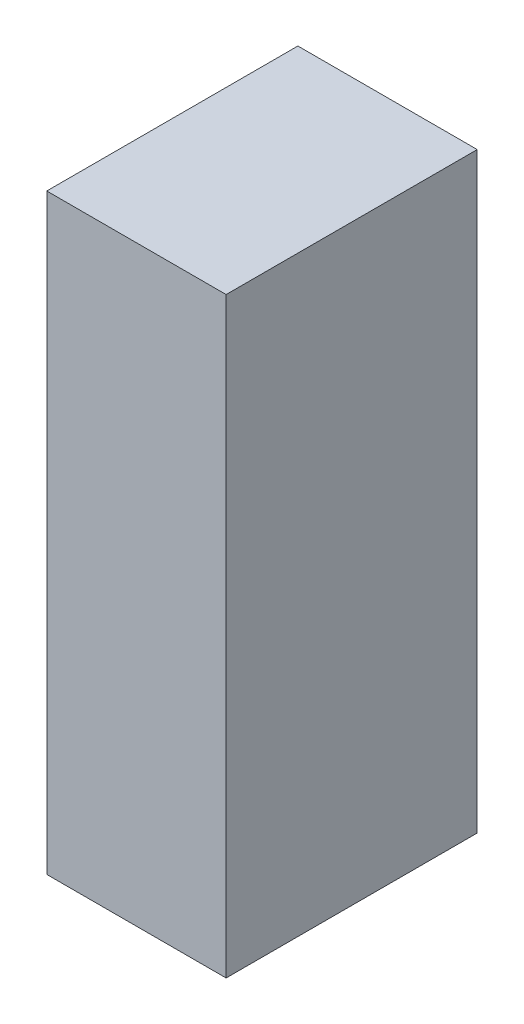
ISO-10303-21;
HEADER;
FILE_DESCRIPTION(('STEP AP214'),'2;1');
FILE_NAME('part.step','',(''),(''),'','','');
FILE_SCHEMA(('AUTOMOTIVE_DESIGN { 1 0 10303 214 1 1 1 1 }'));
ENDSEC;
DATA;
#1=APPLICATION_CONTEXT('core data for automotive mechanical design processes');
#2=APPLICATION_PROTOCOL_DEFINITION('international standard','automotive_design',2000,#1);
#3=PRODUCT_CONTEXT('',#1,'mechanical');
#4=PRODUCT('Part','Part','',(#3));
#5=PRODUCT_RELATED_PRODUCT_CATEGORY('part','',(#4));
#6=PRODUCT_DEFINITION_FORMATION('','',#4);
#7=PRODUCT_DEFINITION_CONTEXT('part definition',#1,'design');
#8=PRODUCT_DEFINITION('design','',#6,#7);
#9=PRODUCT_DEFINITION_SHAPE('','',#8);
#10=(LENGTH_UNIT() NAMED_UNIT(*) SI_UNIT(.MILLI.,.METRE.));
#11=(NAMED_UNIT(*) PLANE_ANGLE_UNIT() SI_UNIT($,.RADIAN.));
#12=(NAMED_UNIT(*) SI_UNIT($,.STERADIAN.) SOLID_ANGLE_UNIT());
#13=UNCERTAINTY_MEASURE_WITH_UNIT(LENGTH_MEASURE(1.E-05),#10,'distance_accuracy_value','');
#14=(GEOMETRIC_REPRESENTATION_CONTEXT(3) GLOBAL_UNCERTAINTY_ASSIGNED_CONTEXT((#13)) GLOBAL_UNIT_ASSIGNED_CONTEXT((#10,
#11,#12)) REPRESENTATION_CONTEXT('',''));
#15=CARTESIAN_POINT('',(0.,0.,0.));
#16=DIRECTION('',(0.,0.,1.));
#17=DIRECTION('',(1.,0.,0.));
#18=AXIS2_PLACEMENT_3D('',#15,#16,#17);
#19=CARTESIAN_POINT('',(1.12500799832787,-0.824997371386331,-2.84311854839325));
#20=DIRECTION('',(-8.74227765734759E-08,-1.,0.));
#21=DIRECTION('',(1.,-8.74227765734759E-08,0.));
#22=AXIS2_PLACEMENT_3D('',#19,#20,#21);
#23=PLANE('',#22);
#24=DIRECTION('',(0.999999999999996,-8.74227766389633E-08,0.));
#25=VECTOR('',#24,1.);
#26=CARTESIAN_POINT('',(1.12500799832787,-0.824997371386331,-2.84311854839325));
#27=LINE('',#26,#25);
#28=CARTESIAN_POINT('',(1.12500799832787,-0.824997371386331,-2.84311854839325));
#29=VERTEX_POINT('',#28);
#30=CARTESIAN_POINT('',(1.62499273953881,-0.824997415096391,-2.84311854839325));
#31=VERTEX_POINT('',#30);
#32=EDGE_CURVE('E11',#29,#31,#27,.T.);
#33=ORIENTED_EDGE('',*,*,#32,.T.);
#34=DIRECTION('',(0.,0.,1.));
#35=VECTOR('',#34,1.);
#36=CARTESIAN_POINT('',(1.62499273953881,-0.824997415096386,-2.84311854839325));
#37=LINE('',#36,#35);
#38=CARTESIAN_POINT('',(1.62499273953881,-0.824997415096391,-2.14311742782593));
#39=VERTEX_POINT('',#38);
#40=EDGE_CURVE('E88',#31,#39,#37,.T.);
#41=ORIENTED_EDGE('',*,*,#40,.T.);
#42=DIRECTION('',(0.999999999999996,-8.74227766389633E-08,0.));
#43=VECTOR('',#42,1.);
#44=CARTESIAN_POINT('',(1.12500799832787,-0.824997371386331,-2.14311742782593));
#45=LINE('',#44,#43);
#46=CARTESIAN_POINT('',(1.12500799832787,-0.824997371386331,-2.14311742782593));
#47=VERTEX_POINT('',#46);
#48=EDGE_CURVE('E83',#47,#39,#45,.T.);
#49=ORIENTED_EDGE('',*,*,#48,.F.);
#50=DIRECTION('',(0.,0.,1.));
#51=VECTOR('',#50,1.);
#52=CARTESIAN_POINT('',(1.12500799832788,-0.824997371386331,-2.84311854839325));
#53=LINE('',#52,#51);
#54=EDGE_CURVE('E72',#29,#47,#53,.T.);
#55=ORIENTED_EDGE('',*,*,#54,.F.);
#56=EDGE_LOOP('',(#33,#41,#49,#55));
#57=FACE_BOUND('',#56,.T.);
#58=ADVANCED_FACE('F17',(#57),#23,.T.);
#59=CARTESIAN_POINT('',(1.62499273953881,-0.824997415096391,-2.84311854839325));
#60=DIRECTION('',(1.,-8.74227765734758E-08,0.));
#61=DIRECTION('',(8.74227765734758E-08,1.,0.));
#62=AXIS2_PLACEMENT_3D('',#59,#60,#61);
#63=PLANE('',#62);
#64=DIRECTION('',(8.74227766352424E-08,0.999999999999996,0.));
#65=VECTOR('',#64,1.);
#66=CARTESIAN_POINT('',(1.62499273953881,-0.824997415096391,-2.84311854839325));
#67=LINE('',#66,#65);
#68=CARTESIAN_POINT('',(1.62499288378586,0.824996481387984,-2.84311854839325));
#69=VERTEX_POINT('',#68);
#70=EDGE_CURVE('E24',#31,#69,#67,.T.);
#71=ORIENTED_EDGE('',*,*,#70,.T.);
#72=DIRECTION('',(0.,0.,1.));
#73=VECTOR('',#72,1.);
#74=CARTESIAN_POINT('',(1.62499288378586,0.824996481387984,-2.84311854839325));
#75=LINE('',#74,#73);
#76=CARTESIAN_POINT('',(1.62499288378586,0.824996481387984,-2.14311742782593));
#77=VERTEX_POINT('',#76);
#78=EDGE_CURVE('E85',#69,#77,#75,.T.);
#79=ORIENTED_EDGE('',*,*,#78,.T.);
#80=DIRECTION('',(8.74227766352424E-08,0.999999999999996,0.));
#81=VECTOR('',#80,1.);
#82=CARTESIAN_POINT('',(1.62499273953881,-0.824997415096391,-2.14311742782593));
#83=LINE('',#82,#81);
#84=EDGE_CURVE('E66',#39,#77,#83,.T.);
#85=ORIENTED_EDGE('',*,*,#84,.F.);
#86=ORIENTED_EDGE('',*,*,#40,.F.);
#87=EDGE_LOOP('',(#71,#79,#85,#86));
#88=FACE_BOUND('',#87,.T.);
#89=ADVANCED_FACE('F89',(#88),#63,.T.);
#90=CARTESIAN_POINT('',(1.62499288378586,0.824996481387984,-2.84311854839325));
#91=DIRECTION('',(8.74227765734759E-08,1.,0.));
#92=DIRECTION('',(-1.,8.74227765734759E-08,0.));
#93=AXIS2_PLACEMENT_3D('',#90,#91,#92);
#94=PLANE('',#93);
#95=DIRECTION('',(-0.999999999999996,8.74227766389633E-08,0.));
#96=VECTOR('',#95,1.);
#97=CARTESIAN_POINT('',(1.62499288378586,0.824996481387984,-2.84311854839325));
#98=LINE('',#97,#96);
#99=CARTESIAN_POINT('',(1.12500814257493,0.824996525098044,-2.84311854839325));
#100=VERTEX_POINT('',#99);
#101=EDGE_CURVE('E62',#69,#100,#98,.T.);
#102=ORIENTED_EDGE('',*,*,#101,.T.);
#103=DIRECTION('',(0.,0.,1.));
#104=VECTOR('',#103,1.);
#105=CARTESIAN_POINT('',(1.12500814257493,0.824996525098039,-2.84311854839325));
#106=LINE('',#105,#104);
#107=CARTESIAN_POINT('',(1.12500814257493,0.824996525098044,-2.14311742782593));
#108=VERTEX_POINT('',#107);
#109=EDGE_CURVE('E55',#100,#108,#106,.T.);
#110=ORIENTED_EDGE('',*,*,#109,.T.);
#111=DIRECTION('',(-0.999999999999996,8.74227766389633E-08,0.));
#112=VECTOR('',#111,1.);
#113=CARTESIAN_POINT('',(1.62499288378586,0.824996481387984,-2.14311742782593));
#114=LINE('',#113,#112);
#115=EDGE_CURVE('E59',#77,#108,#114,.T.);
#116=ORIENTED_EDGE('',*,*,#115,.F.);
#117=ORIENTED_EDGE('',*,*,#78,.F.);
#118=EDGE_LOOP('',(#102,#110,#116,#117));
#119=FACE_BOUND('',#118,.T.);
#120=ADVANCED_FACE('F57',(#119),#94,.T.);
#121=CARTESIAN_POINT('',(1.12500814257493,0.824996525098044,-2.84311854839325));
#122=DIRECTION('',(-1.,8.74227765734758E-08,0.));
#123=DIRECTION('',(-8.74227765734758E-08,-1.,0.));
#124=AXIS2_PLACEMENT_3D('',#121,#122,#123);
#125=PLANE('',#124);
#126=DIRECTION('',(-8.74227766352424E-08,-0.999999999999996,0.));
#127=VECTOR('',#126,1.);
#128=CARTESIAN_POINT('',(1.12500814257493,0.824996525098044,-2.84311854839325));
#129=LINE('',#128,#127);
#130=EDGE_CURVE('E65',#100,#29,#129,.T.);
#131=ORIENTED_EDGE('',*,*,#130,.T.);
#132=ORIENTED_EDGE('',*,*,#54,.T.);
#133=DIRECTION('',(-8.74227766352424E-08,-0.999999999999996,0.));
#134=VECTOR('',#133,1.);
#135=CARTESIAN_POINT('',(1.12500814257493,0.824996525098044,-2.14311742782593));
#136=LINE('',#135,#134);
#137=EDGE_CURVE('E70',#108,#47,#136,.T.);
#138=ORIENTED_EDGE('',*,*,#137,.F.);
#139=ORIENTED_EDGE('',*,*,#109,.F.);
#140=EDGE_LOOP('',(#131,#132,#138,#139));
#141=FACE_BOUND('',#140,.T.);
#142=ADVANCED_FACE('F71',(#141),#125,.T.);
#143=CARTESIAN_POINT('',(170.825012207031,82.224983215332,-2.14311742782593));
#144=DIRECTION('',(0.,0.,1.));
#145=DIRECTION('',(-1.,8.74227765734759E-08,0.));
#146=AXIS2_PLACEMENT_3D('',#143,#144,#145);
#147=PLANE('',#146);
#148=ORIENTED_EDGE('',*,*,#48,.T.);
#149=ORIENTED_EDGE('',*,*,#84,.T.);
#150=ORIENTED_EDGE('',*,*,#115,.T.);
#151=ORIENTED_EDGE('',*,*,#137,.T.);
#152=EDGE_LOOP('',(#148,#149,#150,#151));
#153=FACE_BOUND('',#152,.T.);
#154=ADVANCED_FACE('F76',(#153),#147,.T.);
#155=CARTESIAN_POINT('',(170.825012207031,82.224983215332,-2.84311854839325));
#156=DIRECTION('',(0.,0.,1.));
#157=DIRECTION('',(-1.,8.74227765734759E-08,0.));
#158=AXIS2_PLACEMENT_3D('',#155,#156,#157);
#159=PLANE('',#158);
#160=ORIENTED_EDGE('',*,*,#130,.F.);
#161=ORIENTED_EDGE('',*,*,#101,.F.);
#162=ORIENTED_EDGE('',*,*,#70,.F.);
#163=ORIENTED_EDGE('',*,*,#32,.F.);
#164=EDGE_LOOP('',(#160,#161,#162,#163));
#165=FACE_BOUND('',#164,.T.);
#166=ADVANCED_FACE('F91',(#165),#159,.F.);
#167=CLOSED_SHELL('',(#58,#89,#120,#142,#154,#166));
#168=MANIFOLD_SOLID_BREP('B1',#167);
#169=ADVANCED_BREP_SHAPE_REPRESENTATION('',(#18,#168),#14);
#170=SHAPE_DEFINITION_REPRESENTATION(#9,#169);
ENDSEC;
END-ISO-10303-21;
